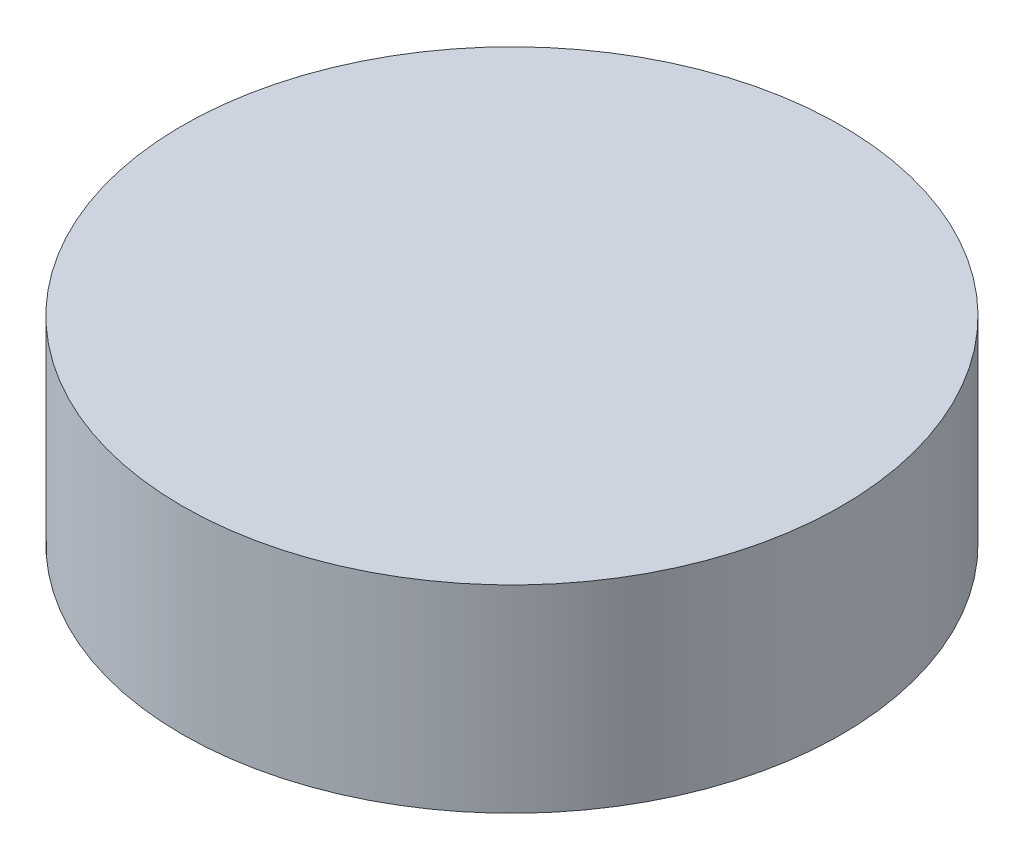
ISO-10303-21;
HEADER;
FILE_DESCRIPTION(('STEP AP214'),'2;1');
FILE_NAME('part.step','',(''),(''),'','','');
FILE_SCHEMA(('AUTOMOTIVE_DESIGN { 1 0 10303 214 1 1 1 1 }'));
ENDSEC;
DATA;
#1=APPLICATION_CONTEXT('core data for automotive mechanical design processes');
#2=APPLICATION_PROTOCOL_DEFINITION('international standard','automotive_design',2000,#1);
#3=PRODUCT_CONTEXT('',#1,'mechanical');
#4=PRODUCT('Part','Part','',(#3));
#5=PRODUCT_RELATED_PRODUCT_CATEGORY('part','',(#4));
#6=PRODUCT_DEFINITION_FORMATION('','',#4);
#7=PRODUCT_DEFINITION_CONTEXT('part definition',#1,'design');
#8=PRODUCT_DEFINITION('design','',#6,#7);
#9=PRODUCT_DEFINITION_SHAPE('','',#8);
#10=(LENGTH_UNIT() NAMED_UNIT(*) SI_UNIT(.MILLI.,.METRE.));
#11=(NAMED_UNIT(*) PLANE_ANGLE_UNIT() SI_UNIT($,.RADIAN.));
#12=(NAMED_UNIT(*) SI_UNIT($,.STERADIAN.) SOLID_ANGLE_UNIT());
#13=UNCERTAINTY_MEASURE_WITH_UNIT(LENGTH_MEASURE(1.E-05),#10,'distance_accuracy_value','');
#14=(GEOMETRIC_REPRESENTATION_CONTEXT(3) GLOBAL_UNCERTAINTY_ASSIGNED_CONTEXT((#13)) GLOBAL_UNIT_ASSIGNED_CONTEXT((#10,
#11,#12)) REPRESENTATION_CONTEXT('',''));
#15=CARTESIAN_POINT('',(0.,0.,0.));
#16=DIRECTION('',(0.,0.,1.));
#17=DIRECTION('',(1.,0.,0.));
#18=AXIS2_PLACEMENT_3D('',#15,#16,#17);
#19=CARTESIAN_POINT('',(0.,7.2,0.));
#20=DIRECTION('',(0.,-1.,0.));
#21=DIRECTION('',(0.,0.,-1.));
#22=AXIS2_PLACEMENT_3D('',#19,#20,#21);
#23=CYLINDRICAL_SURFACE('',#22,12.);
#24=CARTESIAN_POINT('',(0.,7.2,0.));
#25=DIRECTION('',(0.,1.,0.));
#26=DIRECTION('',(0.,0.,1.));
#27=AXIS2_PLACEMENT_3D('',#24,#25,#26);
#28=CIRCLE('',#27,12.);
#29=CARTESIAN_POINT('',(0.,7.2,12.));
#30=VERTEX_POINT('',#29);
#31=EDGE_CURVE('E49',#30,#30,#28,.T.);
#32=ORIENTED_EDGE('',*,*,#31,.F.);
#33=EDGE_LOOP('',(#32));
#34=FACE_BOUND('',#33,.T.);
#35=CARTESIAN_POINT('',(0.,0.,0.));
#36=DIRECTION('',(0.,1.,0.));
#37=DIRECTION('',(0.,0.,1.));
#38=AXIS2_PLACEMENT_3D('',#35,#36,#37);
#39=CIRCLE('',#38,12.);
#40=CARTESIAN_POINT('',(0.,0.,12.));
#41=VERTEX_POINT('',#40);
#42=EDGE_CURVE('E51',#41,#41,#39,.T.);
#43=ORIENTED_EDGE('',*,*,#42,.T.);
#44=EDGE_LOOP('',(#43));
#45=FACE_BOUND('',#44,.T.);
#46=ADVANCED_FACE('F37',(#34,#45),#23,.T.);
#47=CARTESIAN_POINT('',(0.,7.2,0.));
#48=DIRECTION('',(0.,1.,0.));
#49=DIRECTION('',(0.,0.,1.));
#50=AXIS2_PLACEMENT_3D('',#47,#48,#49);
#51=PLANE('',#50);
#52=ORIENTED_EDGE('',*,*,#31,.T.);
#53=EDGE_LOOP('',(#52));
#54=FACE_BOUND('',#53,.T.);
#55=ADVANCED_FACE('F57',(#54),#51,.T.);
#56=CARTESIAN_POINT('',(0.,0.,0.));
#57=DIRECTION('',(0.,1.,0.));
#58=DIRECTION('',(0.,0.,1.));
#59=AXIS2_PLACEMENT_3D('',#56,#57,#58);
#60=PLANE('',#59);
#61=ORIENTED_EDGE('',*,*,#42,.F.);
#62=EDGE_LOOP('',(#61));
#63=FACE_BOUND('',#62,.T.);
#64=ADVANCED_FACE('F64',(#63),#60,.F.);
#65=CLOSED_SHELL('',(#46,#55,#64));
#66=CARTESIAN_POINT('',(0.,7.2,0.));
#67=DIRECTION('',(0.,-1.,0.));
#68=DIRECTION('',(0.,0.,-1.));
#69=AXIS2_PLACEMENT_3D('',#66,#67,#68);
#70=CYLINDRICAL_SURFACE('',#69,9.5);
#71=CARTESIAN_POINT('',(0.,6.2,0.));
#72=DIRECTION('',(0.,1.,0.));
#73=DIRECTION('',(0.,0.,1.));
#74=AXIS2_PLACEMENT_3D('',#71,#72,#73);
#75=CIRCLE('',#74,9.5);
#76=CARTESIAN_POINT('',(0.,6.2,9.5));
#77=VERTEX_POINT('',#76);
#78=EDGE_CURVE('E10',#77,#77,#75,.T.);
#79=ORIENTED_EDGE('',*,*,#78,.T.);
#80=EDGE_LOOP('',(#79));
#81=FACE_BOUND('',#80,.T.);
#82=CARTESIAN_POINT('',(0.,1.,0.));
#83=DIRECTION('',(0.,1.,0.));
#84=DIRECTION('',(0.,0.,1.));
#85=AXIS2_PLACEMENT_3D('',#82,#83,#84);
#86=CIRCLE('',#85,9.5);
#87=CARTESIAN_POINT('',(0.,1.,9.5));
#88=VERTEX_POINT('',#87);
#89=EDGE_CURVE('E41',#88,#88,#86,.T.);
#90=ORIENTED_EDGE('',*,*,#89,.F.);
#91=EDGE_LOOP('',(#90));
#92=FACE_BOUND('',#91,.T.);
#93=ADVANCED_FACE('F73',(#81,#92),#70,.F.);
#94=CARTESIAN_POINT('',(0.,6.2,0.));
#95=DIRECTION('',(0.,1.,0.));
#96=DIRECTION('',(0.,0.,1.));
#97=AXIS2_PLACEMENT_3D('',#94,#95,#96);
#98=PLANE('',#97);
#99=ORIENTED_EDGE('',*,*,#78,.F.);
#100=EDGE_LOOP('',(#99));
#101=FACE_BOUND('',#100,.T.);
#102=ADVANCED_FACE('F74',(#101),#98,.F.);
#103=CARTESIAN_POINT('',(0.,1.,0.));
#104=DIRECTION('',(0.,1.,0.));
#105=DIRECTION('',(0.,0.,1.));
#106=AXIS2_PLACEMENT_3D('',#103,#104,#105);
#107=PLANE('',#106);
#108=ORIENTED_EDGE('',*,*,#89,.T.);
#109=EDGE_LOOP('',(#108));
#110=FACE_BOUND('',#109,.T.);
#111=ADVANCED_FACE('F39',(#110),#107,.T.);
#112=CLOSED_SHELL('',(#93,#102,#111));
#113=ORIENTED_CLOSED_SHELL('',*,#112,.T.);
#114=BREP_WITH_VOIDS('B2',#65,(#113));
#115=ADVANCED_BREP_SHAPE_REPRESENTATION('',(#18,#114),#14);
#116=SHAPE_DEFINITION_REPRESENTATION(#9,#115);
ENDSEC;
END-ISO-10303-21;
